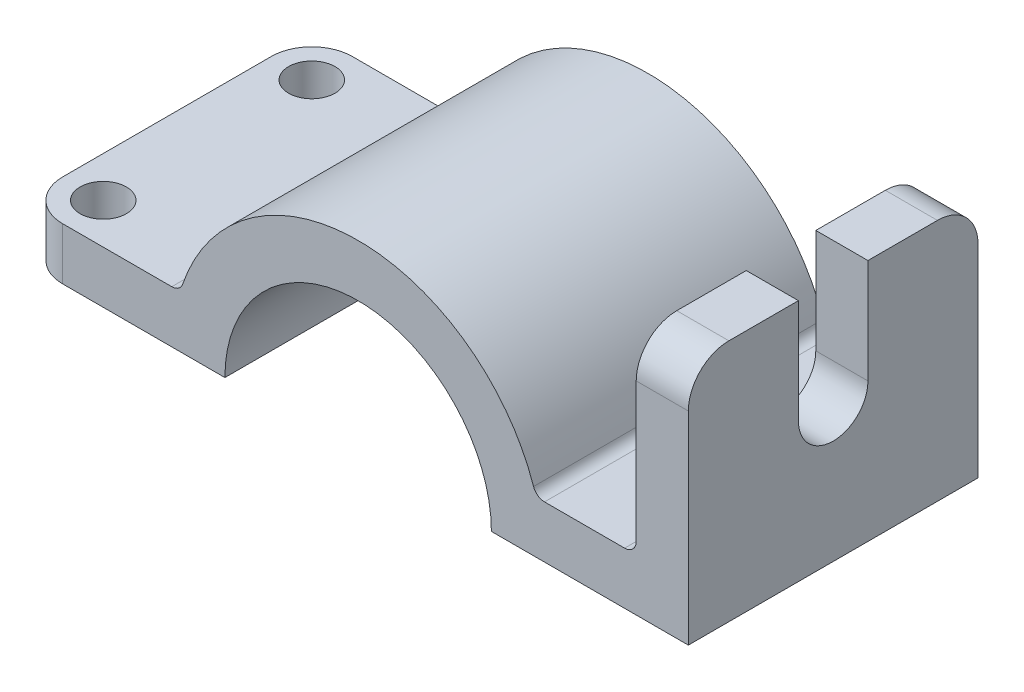
ISO-10303-21;
HEADER;
FILE_DESCRIPTION(('STEP AP214'),'2;1');
FILE_NAME('part.step','',(''),(''),'','','');
FILE_SCHEMA(('AUTOMOTIVE_DESIGN { 1 0 10303 214 1 1 1 1 }'));
ENDSEC;
DATA;
#1=APPLICATION_CONTEXT('core data for automotive mechanical design processes');
#2=APPLICATION_PROTOCOL_DEFINITION('international standard','automotive_design',2000,#1);
#3=PRODUCT_CONTEXT('',#1,'mechanical');
#4=PRODUCT('Part','Part','',(#3));
#5=PRODUCT_RELATED_PRODUCT_CATEGORY('part','',(#4));
#6=PRODUCT_DEFINITION_FORMATION('','',#4);
#7=PRODUCT_DEFINITION_CONTEXT('part definition',#1,'design');
#8=PRODUCT_DEFINITION('design','',#6,#7);
#9=PRODUCT_DEFINITION_SHAPE('','',#8);
#10=(LENGTH_UNIT() NAMED_UNIT(*) SI_UNIT(.MILLI.,.METRE.));
#11=(NAMED_UNIT(*) PLANE_ANGLE_UNIT() SI_UNIT($,.RADIAN.));
#12=(NAMED_UNIT(*) SI_UNIT($,.STERADIAN.) SOLID_ANGLE_UNIT());
#13=UNCERTAINTY_MEASURE_WITH_UNIT(LENGTH_MEASURE(1.E-05),#10,'distance_accuracy_value','');
#14=(GEOMETRIC_REPRESENTATION_CONTEXT(3) GLOBAL_UNCERTAINTY_ASSIGNED_CONTEXT((#13)) GLOBAL_UNIT_ASSIGNED_CONTEXT((#10,
#11,#12)) REPRESENTATION_CONTEXT('',''));
#15=CARTESIAN_POINT('',(0.,0.,0.));
#16=DIRECTION('',(0.,0.,1.));
#17=DIRECTION('',(1.,0.,0.));
#18=AXIS2_PLACEMENT_3D('',#15,#16,#17);
#19=CARTESIAN_POINT('',(57.,42.,25.));
#20=DIRECTION('',(0.,-1.,0.));
#21=DIRECTION('',(0.,0.,-1.));
#22=AXIS2_PLACEMENT_3D('',#19,#20,#21);
#23=PLANE('',#22);
#24=DIRECTION('',(0.,0.,-1.));
#25=VECTOR('',#24,1.);
#26=CARTESIAN_POINT('',(48.,42.,25.));
#27=LINE('',#26,#25);
#28=CARTESIAN_POINT('',(48.,42.,18.));
#29=VERTEX_POINT('',#28);
#30=CARTESIAN_POINT('',(48.,42.,6.));
#31=VERTEX_POINT('',#30);
#32=EDGE_CURVE('E207',#29,#31,#27,.T.);
#33=ORIENTED_EDGE('',*,*,#32,.F.);
#34=DIRECTION('',(-1.,0.,0.));
#35=VECTOR('',#34,1.);
#36=CARTESIAN_POINT('',(57.,42.,18.));
#37=LINE('',#36,#35);
#38=CARTESIAN_POINT('',(57.,42.,18.));
#39=VERTEX_POINT('',#38);
#40=EDGE_CURVE('E322',#29,#39,#37,.F.);
#41=ORIENTED_EDGE('',*,*,#40,.T.);
#42=DIRECTION('',(0.,0.,-1.));
#43=VECTOR('',#42,1.);
#44=CARTESIAN_POINT('',(57.,42.,25.));
#45=LINE('',#44,#43);
#46=CARTESIAN_POINT('',(57.,42.,6.));
#47=VERTEX_POINT('',#46);
#48=EDGE_CURVE('E299',#39,#47,#45,.T.);
#49=ORIENTED_EDGE('',*,*,#48,.T.);
#50=DIRECTION('',(1.,0.,0.));
#51=VECTOR('',#50,1.);
#52=CARTESIAN_POINT('',(-58.001,42.,6.));
#53=LINE('',#52,#51);
#54=EDGE_CURVE('E220',#31,#47,#53,.T.);
#55=ORIENTED_EDGE('',*,*,#54,.F.);
#56=EDGE_LOOP('',(#33,#41,#49,#55));
#57=FACE_BOUND('',#56,.T.);
#58=ADVANCED_FACE('F39',(#57),#23,.F.);
#59=CARTESIAN_POINT('',(57.,42.,-6.));
#60=VERTEX_POINT('',#59);
#61=CARTESIAN_POINT('',(57.,42.,-18.));
#62=VERTEX_POINT('',#61);
#63=EDGE_CURVE('E298',#60,#62,#45,.T.);
#64=ORIENTED_EDGE('',*,*,#63,.T.);
#65=DIRECTION('',(-1.,0.,0.));
#66=VECTOR('',#65,1.);
#67=CARTESIAN_POINT('',(57.,42.,-18.));
#68=LINE('',#67,#66);
#69=CARTESIAN_POINT('',(48.,42.,-18.));
#70=VERTEX_POINT('',#69);
#71=EDGE_CURVE('E306',#62,#70,#68,.T.);
#72=ORIENTED_EDGE('',*,*,#71,.T.);
#73=CARTESIAN_POINT('',(48.,42.,-6.));
#74=VERTEX_POINT('',#73);
#75=EDGE_CURVE('E300',#74,#70,#27,.T.);
#76=ORIENTED_EDGE('',*,*,#75,.F.);
#77=DIRECTION('',(-1.,0.,0.));
#78=VECTOR('',#77,1.);
#79=CARTESIAN_POINT('',(-58.001,42.,-6.));
#80=LINE('',#79,#78);
#81=EDGE_CURVE('E204',#60,#74,#80,.T.);
#82=ORIENTED_EDGE('',*,*,#81,.F.);
#83=EDGE_LOOP('',(#64,#72,#76,#82));
#84=FACE_BOUND('',#83,.T.);
#85=ADVANCED_FACE('F411',(#84),#23,.F.);
#86=CARTESIAN_POINT('',(57.,0.,25.));
#87=DIRECTION('',(-1.,0.,0.));
#88=DIRECTION('',(0.,0.,1.));
#89=AXIS2_PLACEMENT_3D('',#86,#87,#88);
#90=PLANE('',#89);
#91=DIRECTION('',(0.,1.,0.));
#92=VECTOR('',#91,1.);
#93=CARTESIAN_POINT('',(57.,0.,-25.));
#94=LINE('',#93,#92);
#95=CARTESIAN_POINT('',(57.,0.,-25.));
#96=VERTEX_POINT('',#95);
#97=CARTESIAN_POINT('',(57.,35.,-25.));
#98=VERTEX_POINT('',#97);
#99=EDGE_CURVE('E255',#96,#98,#94,.T.);
#100=ORIENTED_EDGE('',*,*,#99,.T.);
#101=CARTESIAN_POINT('',(57.,35.,-18.));
#102=DIRECTION('',(-1.,0.,0.));
#103=DIRECTION('',(0.,0.,1.));
#104=AXIS2_PLACEMENT_3D('',#101,#102,#103);
#105=CIRCLE('',#104,7.);
#106=EDGE_CURVE('E317',#98,#62,#105,.F.);
#107=ORIENTED_EDGE('',*,*,#106,.T.);
#108=ORIENTED_EDGE('',*,*,#63,.F.);
#109=DIRECTION('',(0.,1.,0.));
#110=VECTOR('',#109,1.);
#111=CARTESIAN_POINT('',(57.,24.,-6.));
#112=LINE('',#111,#110);
#113=CARTESIAN_POINT('',(57.,24.,-6.));
#114=VERTEX_POINT('',#113);
#115=EDGE_CURVE('E198',#114,#60,#112,.T.);
#116=ORIENTED_EDGE('',*,*,#115,.F.);
#117=CARTESIAN_POINT('',(57.,24.,0.));
#118=DIRECTION('',(1.,0.,0.));
#119=DIRECTION('',(0.,0.,-1.));
#120=AXIS2_PLACEMENT_3D('',#117,#118,#119);
#121=CIRCLE('',#120,6.);
#122=CARTESIAN_POINT('',(57.,24.,6.));
#123=VERTEX_POINT('',#122);
#124=EDGE_CURVE('E212',#123,#114,#121,.T.);
#125=ORIENTED_EDGE('',*,*,#124,.F.);
#126=DIRECTION('',(0.,-1.,0.));
#127=VECTOR('',#126,1.);
#128=CARTESIAN_POINT('',(57.,24.,6.));
#129=LINE('',#128,#127);
#130=EDGE_CURVE('E193',#47,#123,#129,.T.);
#131=ORIENTED_EDGE('',*,*,#130,.F.);
#132=ORIENTED_EDGE('',*,*,#48,.F.);
#133=CARTESIAN_POINT('',(57.,35.,18.));
#134=DIRECTION('',(-1.,0.,0.));
#135=DIRECTION('',(0.,0.,1.));
#136=AXIS2_PLACEMENT_3D('',#133,#134,#135);
#137=CIRCLE('',#136,7.);
#138=CARTESIAN_POINT('',(57.,35.,25.));
#139=VERTEX_POINT('',#138);
#140=EDGE_CURVE('E320',#39,#139,#137,.F.);
#141=ORIENTED_EDGE('',*,*,#140,.T.);
#142=DIRECTION('',(0.,1.,0.));
#143=VECTOR('',#142,1.);
#144=CARTESIAN_POINT('',(57.,0.,25.));
#145=LINE('',#144,#143);
#146=CARTESIAN_POINT('',(57.,0.,25.));
#147=VERTEX_POINT('',#146);
#148=EDGE_CURVE('E228',#147,#139,#145,.T.);
#149=ORIENTED_EDGE('',*,*,#148,.F.);
#150=DIRECTION('',(0.,0.,-1.));
#151=VECTOR('',#150,1.);
#152=CARTESIAN_POINT('',(57.,0.,25.));
#153=LINE('',#152,#151);
#154=EDGE_CURVE('E305',#147,#96,#153,.T.);
#155=ORIENTED_EDGE('',*,*,#154,.T.);
#156=EDGE_LOOP('',(#100,#107,#108,#116,#125,#131,#132,#141,#149,#155));
#157=FACE_BOUND('',#156,.T.);
#158=ADVANCED_FACE('F371',(#157),#90,.F.);
#159=CARTESIAN_POINT('',(48.,42.,25.));
#160=DIRECTION('',(1.,0.,0.));
#161=DIRECTION('',(0.,1.,0.));
#162=AXIS2_PLACEMENT_3D('',#159,#160,#161);
#163=PLANE('',#162);
#164=ORIENTED_EDGE('',*,*,#75,.T.);
#165=CARTESIAN_POINT('',(48.,35.,-18.));
#166=DIRECTION('',(1.,0.,0.));
#167=DIRECTION('',(0.,1.,0.));
#168=AXIS2_PLACEMENT_3D('',#165,#166,#167);
#169=CIRCLE('',#168,7.);
#170=CARTESIAN_POINT('',(48.,35.,-25.));
#171=VERTEX_POINT('',#170);
#172=EDGE_CURVE('E311',#70,#171,#169,.F.);
#173=ORIENTED_EDGE('',*,*,#172,.T.);
#174=DIRECTION('',(0.,-1.,0.));
#175=VECTOR('',#174,1.);
#176=CARTESIAN_POINT('',(48.,42.,-25.));
#177=LINE('',#176,#175);
#178=CARTESIAN_POINT('',(48.,11.,-25.));
#179=VERTEX_POINT('',#178);
#180=EDGE_CURVE('E260',#171,#179,#177,.T.);
#181=ORIENTED_EDGE('',*,*,#180,.T.);
#182=DIRECTION('',(0.,0.,-1.));
#183=VECTOR('',#182,1.);
#184=CARTESIAN_POINT('',(48.,11.,25.));
#185=LINE('',#184,#183);
#186=CARTESIAN_POINT('',(48.,11.,25.));
#187=VERTEX_POINT('',#186);
#188=EDGE_CURVE('E294',#187,#179,#185,.T.);
#189=ORIENTED_EDGE('',*,*,#188,.F.);
#190=DIRECTION('',(0.,-1.,0.));
#191=VECTOR('',#190,1.);
#192=CARTESIAN_POINT('',(48.,42.,25.));
#193=LINE('',#192,#191);
#194=CARTESIAN_POINT('',(48.,35.,25.));
#195=VERTEX_POINT('',#194);
#196=EDGE_CURVE('E235',#195,#187,#193,.T.);
#197=ORIENTED_EDGE('',*,*,#196,.F.);
#198=CARTESIAN_POINT('',(48.,35.,18.));
#199=DIRECTION('',(1.,0.,0.));
#200=DIRECTION('',(0.,1.,0.));
#201=AXIS2_PLACEMENT_3D('',#198,#199,#200);
#202=CIRCLE('',#201,7.);
#203=EDGE_CURVE('E313',#195,#29,#202,.F.);
#204=ORIENTED_EDGE('',*,*,#203,.T.);
#205=ORIENTED_EDGE('',*,*,#32,.T.);
#206=DIRECTION('',(0.,1.,0.));
#207=VECTOR('',#206,1.);
#208=CARTESIAN_POINT('',(48.,24.,6.));
#209=LINE('',#208,#207);
#210=CARTESIAN_POINT('',(48.,24.,6.));
#211=VERTEX_POINT('',#210);
#212=EDGE_CURVE('E187',#211,#31,#209,.T.);
#213=ORIENTED_EDGE('',*,*,#212,.F.);
#214=CARTESIAN_POINT('',(48.,24.,0.));
#215=DIRECTION('',(1.,0.,0.));
#216=DIRECTION('',(0.,1.,0.));
#217=AXIS2_PLACEMENT_3D('',#214,#215,#216);
#218=CIRCLE('',#217,6.);
#219=CARTESIAN_POINT('',(48.,24.,-6.));
#220=VERTEX_POINT('',#219);
#221=EDGE_CURVE('E199',#220,#211,#218,.F.);
#222=ORIENTED_EDGE('',*,*,#221,.F.);
#223=DIRECTION('',(0.,-1.,0.));
#224=VECTOR('',#223,1.);
#225=CARTESIAN_POINT('',(48.,24.,-6.));
#226=LINE('',#225,#224);
#227=EDGE_CURVE('E209',#74,#220,#226,.T.);
#228=ORIENTED_EDGE('',*,*,#227,.F.);
#229=EDGE_LOOP('',(#164,#173,#181,#189,#197,#204,#205,#213,#222,#228));
#230=FACE_BOUND('',#229,.T.);
#231=ADVANCED_FACE('F210',(#230),#163,.F.);
#232=CARTESIAN_POINT('',(0.,0.,25.));
#233=DIRECTION('',(0.,0.,-1.));
#234=DIRECTION('',(-1.,0.,0.));
#235=AXIS2_PLACEMENT_3D('',#232,#233,#234);
#236=CYLINDRICAL_SURFACE('',#235,23.);
#237=CARTESIAN_POINT('',(0.,0.,-25.));
#238=DIRECTION('',(0.,0.,-1.));
#239=DIRECTION('',(1.,0.,0.));
#240=AXIS2_PLACEMENT_3D('',#237,#238,#239);
#241=CIRCLE('',#240,23.);
#242=CARTESIAN_POINT('',(-23.,0.,-25.));
#243=VERTEX_POINT('',#242);
#244=CARTESIAN_POINT('',(23.,0.,-25.));
#245=VERTEX_POINT('',#244);
#246=EDGE_CURVE('E225',#243,#245,#241,.T.);
#247=ORIENTED_EDGE('',*,*,#246,.T.);
#248=DIRECTION('',(0.,0.,-1.));
#249=VECTOR('',#248,1.);
#250=CARTESIAN_POINT('',(23.,0.,25.));
#251=LINE('',#250,#249);
#252=CARTESIAN_POINT('',(23.,0.,25.));
#253=VERTEX_POINT('',#252);
#254=EDGE_CURVE('E304',#253,#245,#251,.T.);
#255=ORIENTED_EDGE('',*,*,#254,.F.);
#256=CARTESIAN_POINT('',(0.,0.,25.));
#257=DIRECTION('',(0.,0.,-1.));
#258=DIRECTION('',(1.,0.,0.));
#259=AXIS2_PLACEMENT_3D('',#256,#257,#258);
#260=CIRCLE('',#259,23.);
#261=CARTESIAN_POINT('',(-23.,0.,25.));
#262=VERTEX_POINT('',#261);
#263=EDGE_CURVE('E224',#262,#253,#260,.T.);
#264=ORIENTED_EDGE('',*,*,#263,.F.);
#265=DIRECTION('',(0.,0.,-1.));
#266=VECTOR('',#265,1.);
#267=CARTESIAN_POINT('',(-23.,0.,25.));
#268=LINE('',#267,#266);
#269=EDGE_CURVE('E247',#262,#243,#268,.T.);
#270=ORIENTED_EDGE('',*,*,#269,.T.);
#271=EDGE_LOOP('',(#247,#255,#264,#270));
#272=FACE_BOUND('',#271,.T.);
#273=ADVANCED_FACE('F361',(#272),#236,.F.);
#274=CARTESIAN_POINT('',(23.,0.,25.));
#275=DIRECTION('',(0.,1.,0.));
#276=DIRECTION('',(0.,0.,1.));
#277=AXIS2_PLACEMENT_3D('',#274,#275,#276);
#278=PLANE('',#277);
#279=DIRECTION('',(1.,0.,0.));
#280=VECTOR('',#279,1.);
#281=CARTESIAN_POINT('',(23.,0.,-25.));
#282=LINE('',#281,#280);
#283=EDGE_CURVE('E252',#245,#96,#282,.T.);
#284=ORIENTED_EDGE('',*,*,#283,.T.);
#285=ORIENTED_EDGE('',*,*,#154,.F.);
#286=DIRECTION('',(1.,0.,0.));
#287=VECTOR('',#286,1.);
#288=CARTESIAN_POINT('',(23.,0.,25.));
#289=LINE('',#288,#287);
#290=EDGE_CURVE('E226',#253,#147,#289,.T.);
#291=ORIENTED_EDGE('',*,*,#290,.F.);
#292=ORIENTED_EDGE('',*,*,#254,.T.);
#293=EDGE_LOOP('',(#284,#285,#291,#292));
#294=FACE_BOUND('',#293,.T.);
#295=ADVANCED_FACE('F369',(#294),#278,.F.);
#296=CARTESIAN_POINT('',(46.,11.,25.));
#297=DIRECTION('',(0.,0.,-1.));
#298=DIRECTION('',(-1.,0.,0.));
#299=AXIS2_PLACEMENT_3D('',#296,#297,#298);
#300=CYLINDRICAL_SURFACE('',#299,2.);
#301=CARTESIAN_POINT('',(46.,11.,-25.));
#302=DIRECTION('',(0.,0.,-1.));
#303=DIRECTION('',(-1.,0.,0.));
#304=AXIS2_PLACEMENT_3D('',#301,#302,#303);
#305=CIRCLE('',#304,2.);
#306=CARTESIAN_POINT('',(46.,9.00000000000001,-25.));
#307=VERTEX_POINT('',#306);
#308=EDGE_CURVE('E259',#179,#307,#305,.T.);
#309=ORIENTED_EDGE('',*,*,#308,.T.);
#310=DIRECTION('',(0.,0.,-1.));
#311=VECTOR('',#310,1.);
#312=CARTESIAN_POINT('',(46.,9.00000000000001,25.));
#313=LINE('',#312,#311);
#314=CARTESIAN_POINT('',(46.,9.00000000000001,25.));
#315=VERTEX_POINT('',#314);
#316=EDGE_CURVE('E292',#315,#307,#313,.T.);
#317=ORIENTED_EDGE('',*,*,#316,.F.);
#318=CARTESIAN_POINT('',(46.,11.,25.));
#319=DIRECTION('',(0.,0.,-1.));
#320=DIRECTION('',(-1.,0.,0.));
#321=AXIS2_PLACEMENT_3D('',#318,#319,#320);
#322=CIRCLE('',#321,2.);
#323=EDGE_CURVE('E232',#187,#315,#322,.T.);
#324=ORIENTED_EDGE('',*,*,#323,.F.);
#325=ORIENTED_EDGE('',*,*,#188,.T.);
#326=EDGE_LOOP('',(#309,#317,#324,#325));
#327=FACE_BOUND('',#326,.T.);
#328=ADVANCED_FACE('F383',(#327),#300,.F.);
#329=CARTESIAN_POINT('',(46.,9.00000000000001,25.));
#330=DIRECTION('',(0.,-1.,0.));
#331=DIRECTION('',(1.,0.,0.));
#332=AXIS2_PLACEMENT_3D('',#329,#330,#331);
#333=PLANE('',#332);
#334=DIRECTION('',(-1.,0.,0.));
#335=VECTOR('',#334,1.);
#336=CARTESIAN_POINT('',(46.,9.00000000000001,-25.));
#337=LINE('',#336,#335);
#338=CARTESIAN_POINT('',(32.1714158842908,9.,-25.));
#339=VERTEX_POINT('',#338);
#340=EDGE_CURVE('E261',#307,#339,#337,.T.);
#341=ORIENTED_EDGE('',*,*,#340,.T.);
#342=DIRECTION('',(0.,0.,-1.));
#343=VECTOR('',#342,1.);
#344=CARTESIAN_POINT('',(32.1714158842908,9.,25.));
#345=LINE('',#344,#343);
#346=CARTESIAN_POINT('',(32.1714158842908,9.,25.));
#347=VERTEX_POINT('',#346);
#348=EDGE_CURVE('E286',#347,#339,#345,.T.);
#349=ORIENTED_EDGE('',*,*,#348,.F.);
#350=DIRECTION('',(-1.,0.,0.));
#351=VECTOR('',#350,1.);
#352=CARTESIAN_POINT('',(46.,9.00000000000001,25.));
#353=LINE('',#352,#351);
#354=EDGE_CURVE('E237',#315,#347,#353,.T.);
#355=ORIENTED_EDGE('',*,*,#354,.F.);
#356=ORIENTED_EDGE('',*,*,#316,.T.);
#357=EDGE_LOOP('',(#341,#349,#355,#356));
#358=FACE_BOUND('',#357,.T.);
#359=ADVANCED_FACE('F388',(#358),#333,.F.);
#360=CARTESIAN_POINT('',(32.1714158842908,11.,25.));
#361=DIRECTION('',(0.,0.,-1.));
#362=DIRECTION('',(-1.,0.,0.));
#363=AXIS2_PLACEMENT_3D('',#360,#361,#362);
#364=CYLINDRICAL_SURFACE('',#363,2.);
#365=CARTESIAN_POINT('',(32.1714158842908,11.,-25.));
#366=DIRECTION('',(0.,0.,-1.));
#367=DIRECTION('',(-1.,0.,0.));
#368=AXIS2_PLACEMENT_3D('',#365,#366,#367);
#369=CIRCLE('',#368,2.);
#370=CARTESIAN_POINT('',(30.2789796558031,10.3529411764706,-25.));
#371=VERTEX_POINT('',#370);
#372=EDGE_CURVE('E263',#339,#371,#369,.T.);
#373=ORIENTED_EDGE('',*,*,#372,.T.);
#374=DIRECTION('',(0.,0.,-1.));
#375=VECTOR('',#374,1.);
#376=CARTESIAN_POINT('',(30.2789796558031,10.3529411764706,25.));
#377=LINE('',#376,#375);
#378=CARTESIAN_POINT('',(30.2789796558031,10.3529411764706,25.));
#379=VERTEX_POINT('',#378);
#380=EDGE_CURVE('E284',#379,#371,#377,.T.);
#381=ORIENTED_EDGE('',*,*,#380,.F.);
#382=CARTESIAN_POINT('',(32.1714158842908,11.,25.));
#383=DIRECTION('',(0.,0.,-1.));
#384=DIRECTION('',(-1.,0.,0.));
#385=AXIS2_PLACEMENT_3D('',#382,#383,#384);
#386=CIRCLE('',#385,2.);
#387=EDGE_CURVE('E236',#347,#379,#386,.T.);
#388=ORIENTED_EDGE('',*,*,#387,.F.);
#389=ORIENTED_EDGE('',*,*,#348,.T.);
#390=EDGE_LOOP('',(#373,#381,#388,#389));
#391=FACE_BOUND('',#390,.T.);
#392=ADVANCED_FACE('F393',(#391),#364,.F.);
#393=CARTESIAN_POINT('',(0.,0.,25.));
#394=DIRECTION('',(0.,0.,-1.));
#395=DIRECTION('',(-1.,0.,0.));
#396=AXIS2_PLACEMENT_3D('',#393,#394,#395);
#397=CYLINDRICAL_SURFACE('',#396,32.);
#398=CARTESIAN_POINT('',(0.,0.,-25.));
#399=DIRECTION('',(0.,0.,1.));
#400=DIRECTION('',(1.,0.,0.));
#401=AXIS2_PLACEMENT_3D('',#398,#399,#400);
#402=CIRCLE('',#401,32.);
#403=CARTESIAN_POINT('',(-30.2789796558031,10.3529411764706,-25.));
#404=VERTEX_POINT('',#403);
#405=EDGE_CURVE('E264',#371,#404,#402,.T.);
#406=ORIENTED_EDGE('',*,*,#405,.T.);
#407=DIRECTION('',(0.,0.,-1.));
#408=VECTOR('',#407,1.);
#409=CARTESIAN_POINT('',(-30.2789796558031,10.3529411764706,25.));
#410=LINE('',#409,#408);
#411=CARTESIAN_POINT('',(-30.2789796558031,10.3529411764706,25.));
#412=VERTEX_POINT('',#411);
#413=EDGE_CURVE('E285',#412,#404,#410,.T.);
#414=ORIENTED_EDGE('',*,*,#413,.F.);
#415=CARTESIAN_POINT('',(0.,0.,25.));
#416=DIRECTION('',(0.,0.,1.));
#417=DIRECTION('',(1.,0.,0.));
#418=AXIS2_PLACEMENT_3D('',#415,#416,#417);
#419=CIRCLE('',#418,32.);
#420=EDGE_CURVE('E238',#379,#412,#419,.T.);
#421=ORIENTED_EDGE('',*,*,#420,.F.);
#422=ORIENTED_EDGE('',*,*,#380,.T.);
#423=EDGE_LOOP('',(#406,#414,#421,#422));
#424=FACE_BOUND('',#423,.T.);
#425=ADVANCED_FACE('F397',(#424),#397,.T.);
#426=CARTESIAN_POINT('',(-32.1714158842908,11.,25.));
#427=DIRECTION('',(0.,0.,-1.));
#428=DIRECTION('',(-1.,0.,0.));
#429=AXIS2_PLACEMENT_3D('',#426,#427,#428);
#430=CYLINDRICAL_SURFACE('',#429,2.);
#431=CARTESIAN_POINT('',(-32.1714158842908,11.,-25.));
#432=DIRECTION('',(0.,0.,-1.));
#433=DIRECTION('',(1.,0.,0.));
#434=AXIS2_PLACEMENT_3D('',#431,#432,#433);
#435=CIRCLE('',#434,2.);
#436=CARTESIAN_POINT('',(-32.1714158842908,9.,-25.));
#437=VERTEX_POINT('',#436);
#438=EDGE_CURVE('E270',#404,#437,#435,.T.);
#439=ORIENTED_EDGE('',*,*,#438,.T.);
#440=DIRECTION('',(0.,0.,-1.));
#441=VECTOR('',#440,1.);
#442=CARTESIAN_POINT('',(-32.1714158842908,9.,25.));
#443=LINE('',#442,#441);
#444=CARTESIAN_POINT('',(-32.1714158842908,9.,25.));
#445=VERTEX_POINT('',#444);
#446=EDGE_CURVE('E276',#445,#437,#443,.T.);
#447=ORIENTED_EDGE('',*,*,#446,.F.);
#448=CARTESIAN_POINT('',(-32.1714158842908,11.,25.));
#449=DIRECTION('',(0.,0.,-1.));
#450=DIRECTION('',(1.,0.,0.));
#451=AXIS2_PLACEMENT_3D('',#448,#449,#450);
#452=CIRCLE('',#451,2.);
#453=EDGE_CURVE('E245',#412,#445,#452,.T.);
#454=ORIENTED_EDGE('',*,*,#453,.F.);
#455=ORIENTED_EDGE('',*,*,#413,.T.);
#456=EDGE_LOOP('',(#439,#447,#454,#455));
#457=FACE_BOUND('',#456,.T.);
#458=ADVANCED_FACE('F405',(#457),#430,.F.);
#459=CARTESIAN_POINT('',(-32.1714158842908,9.,25.));
#460=DIRECTION('',(0.,-1.,0.));
#461=DIRECTION('',(1.,0.,0.));
#462=AXIS2_PLACEMENT_3D('',#459,#460,#461);
#463=PLANE('',#462);
#464=CARTESIAN_POINT('',(-51.,9.,-18.));
#465=DIRECTION('',(0.,1.,0.));
#466=DIRECTION('',(-1.,0.,0.));
#467=AXIS2_PLACEMENT_3D('',#464,#465,#466);
#468=CIRCLE('',#467,4.);
#469=CARTESIAN_POINT('',(-55.,9.,-18.));
#470=VERTEX_POINT('',#469);
#471=EDGE_CURVE('E425',#470,#470,#468,.T.);
#472=ORIENTED_EDGE('',*,*,#471,.F.);
#473=EDGE_LOOP('',(#472));
#474=FACE_BOUND('',#473,.T.);
#475=CARTESIAN_POINT('',(-51.,9.,18.));
#476=DIRECTION('',(0.,1.,0.));
#477=DIRECTION('',(-1.,0.,0.));
#478=AXIS2_PLACEMENT_3D('',#475,#476,#477);
#479=CIRCLE('',#478,4.);
#480=CARTESIAN_POINT('',(-55.,9.,18.));
#481=VERTEX_POINT('',#480);
#482=EDGE_CURVE('E420',#481,#481,#479,.T.);
#483=ORIENTED_EDGE('',*,*,#482,.F.);
#484=EDGE_LOOP('',(#483));
#485=FACE_BOUND('',#484,.T.);
#486=DIRECTION('',(0.,0.,-1.));
#487=VECTOR('',#486,1.);
#488=CARTESIAN_POINT('',(-58.,9.,25.));
#489=LINE('',#488,#487);
#490=CARTESIAN_POINT('',(-58.,9.,18.));
#491=VERTEX_POINT('',#490);
#492=CARTESIAN_POINT('',(-58.,9.,-18.));
#493=VERTEX_POINT('',#492);
#494=EDGE_CURVE('E280',#491,#493,#489,.T.);
#495=ORIENTED_EDGE('',*,*,#494,.F.);
#496=CARTESIAN_POINT('',(-51.,9.,18.));
#497=DIRECTION('',(0.,-1.,0.));
#498=DIRECTION('',(1.,0.,0.));
#499=AXIS2_PLACEMENT_3D('',#496,#497,#498);
#500=CIRCLE('',#499,7.);
#501=CARTESIAN_POINT('',(-51.,9.,25.));
#502=VERTEX_POINT('',#501);
#503=EDGE_CURVE('E50',#491,#502,#500,.F.);
#504=ORIENTED_EDGE('',*,*,#503,.T.);
#505=DIRECTION('',(-1.,0.,0.));
#506=VECTOR('',#505,1.);
#507=CARTESIAN_POINT('',(-32.1714158842908,9.,25.));
#508=LINE('',#507,#506);
#509=EDGE_CURVE('E243',#445,#502,#508,.T.);
#510=ORIENTED_EDGE('',*,*,#509,.F.);
#511=ORIENTED_EDGE('',*,*,#446,.T.);
#512=DIRECTION('',(-1.,0.,0.));
#513=VECTOR('',#512,1.);
#514=CARTESIAN_POINT('',(-32.1714158842908,9.,-25.));
#515=LINE('',#514,#513);
#516=CARTESIAN_POINT('',(-51.,9.,-25.));
#517=VERTEX_POINT('',#516);
#518=EDGE_CURVE('E267',#437,#517,#515,.T.);
#519=ORIENTED_EDGE('',*,*,#518,.T.);
#520=CARTESIAN_POINT('',(-51.,9.,-18.));
#521=DIRECTION('',(0.,-1.,0.));
#522=DIRECTION('',(1.,0.,0.));
#523=AXIS2_PLACEMENT_3D('',#520,#521,#522);
#524=CIRCLE('',#523,7.);
#525=EDGE_CURVE('E56',#517,#493,#524,.F.);
#526=ORIENTED_EDGE('',*,*,#525,.T.);
#527=EDGE_LOOP('',(#495,#504,#510,#511,#519,#526));
#528=FACE_BOUND('',#527,.T.);
#529=ADVANCED_FACE('F339',(#474,#485,#528),#463,.F.);
#530=CARTESIAN_POINT('',(-58.,9.,25.));
#531=DIRECTION('',(1.,0.,0.));
#532=DIRECTION('',(0.,0.,-1.));
#533=AXIS2_PLACEMENT_3D('',#530,#531,#532);
#534=PLANE('',#533);
#535=DIRECTION('',(0.,0.,-1.));
#536=VECTOR('',#535,1.);
#537=CARTESIAN_POINT('',(-58.,0.,25.));
#538=LINE('',#537,#536);
#539=CARTESIAN_POINT('',(-58.,0.,18.));
#540=VERTEX_POINT('',#539);
#541=CARTESIAN_POINT('',(-58.,0.,-18.));
#542=VERTEX_POINT('',#541);
#543=EDGE_CURVE('E273',#540,#542,#538,.T.);
#544=ORIENTED_EDGE('',*,*,#543,.F.);
#545=DIRECTION('',(0.,-1.,0.));
#546=VECTOR('',#545,1.);
#547=CARTESIAN_POINT('',(-58.,9.,18.));
#548=LINE('',#547,#546);
#549=EDGE_CURVE('E336',#540,#491,#548,.F.);
#550=ORIENTED_EDGE('',*,*,#549,.T.);
#551=ORIENTED_EDGE('',*,*,#494,.T.);
#552=DIRECTION('',(0.,-1.,0.));
#553=VECTOR('',#552,1.);
#554=CARTESIAN_POINT('',(-58.,9.,-18.));
#555=LINE('',#554,#553);
#556=EDGE_CURVE('E334',#493,#542,#555,.T.);
#557=ORIENTED_EDGE('',*,*,#556,.T.);
#558=EDGE_LOOP('',(#544,#550,#551,#557));
#559=FACE_BOUND('',#558,.T.);
#560=ADVANCED_FACE('F354',(#559),#534,.F.);
#561=CARTESIAN_POINT('',(-58.,0.,25.));
#562=DIRECTION('',(0.,1.,0.));
#563=DIRECTION('',(0.,0.,1.));
#564=AXIS2_PLACEMENT_3D('',#561,#562,#563);
#565=PLANE('',#564);
#566=CARTESIAN_POINT('',(-51.,0.,-18.));
#567=DIRECTION('',(0.,1.,0.));
#568=DIRECTION('',(0.,0.,1.));
#569=AXIS2_PLACEMENT_3D('',#566,#567,#568);
#570=CIRCLE('',#569,4.);
#571=CARTESIAN_POINT('',(-51.,0.,-14.));
#572=VERTEX_POINT('',#571);
#573=EDGE_CURVE('E218',#572,#572,#570,.F.);
#574=ORIENTED_EDGE('',*,*,#573,.F.);
#575=EDGE_LOOP('',(#574));
#576=FACE_BOUND('',#575,.T.);
#577=CARTESIAN_POINT('',(-51.,0.,18.));
#578=DIRECTION('',(0.,1.,0.));
#579=DIRECTION('',(0.,0.,1.));
#580=AXIS2_PLACEMENT_3D('',#577,#578,#579);
#581=CIRCLE('',#580,4.);
#582=CARTESIAN_POINT('',(-51.,0.,22.));
#583=VERTEX_POINT('',#582);
#584=EDGE_CURVE('E421',#583,#583,#581,.F.);
#585=ORIENTED_EDGE('',*,*,#584,.F.);
#586=EDGE_LOOP('',(#585));
#587=FACE_BOUND('',#586,.T.);
#588=DIRECTION('',(1.,0.,0.));
#589=VECTOR('',#588,1.);
#590=CARTESIAN_POINT('',(-58.,0.,25.));
#591=LINE('',#590,#589);
#592=CARTESIAN_POINT('',(-51.,0.,25.));
#593=VERTEX_POINT('',#592);
#594=EDGE_CURVE('E250',#593,#262,#591,.T.);
#595=ORIENTED_EDGE('',*,*,#594,.F.);
#596=CARTESIAN_POINT('',(-51.,0.,18.));
#597=DIRECTION('',(0.,1.,0.));
#598=DIRECTION('',(0.,0.,1.));
#599=AXIS2_PLACEMENT_3D('',#596,#597,#598);
#600=CIRCLE('',#599,7.);
#601=EDGE_CURVE('E332',#593,#540,#600,.F.);
#602=ORIENTED_EDGE('',*,*,#601,.T.);
#603=ORIENTED_EDGE('',*,*,#543,.T.);
#604=CARTESIAN_POINT('',(-51.,0.,-18.));
#605=DIRECTION('',(0.,1.,0.));
#606=DIRECTION('',(0.,0.,1.));
#607=AXIS2_PLACEMENT_3D('',#604,#605,#606);
#608=CIRCLE('',#607,7.);
#609=CARTESIAN_POINT('',(-51.,0.,-25.));
#610=VERTEX_POINT('',#609);
#611=EDGE_CURVE('E328',#542,#610,#608,.F.);
#612=ORIENTED_EDGE('',*,*,#611,.T.);
#613=DIRECTION('',(1.,0.,0.));
#614=VECTOR('',#613,1.);
#615=CARTESIAN_POINT('',(-58.,0.,-25.));
#616=LINE('',#615,#614);
#617=EDGE_CURVE('E230',#610,#243,#616,.T.);
#618=ORIENTED_EDGE('',*,*,#617,.T.);
#619=ORIENTED_EDGE('',*,*,#269,.F.);
#620=EDGE_LOOP('',(#595,#602,#603,#612,#618,#619));
#621=FACE_BOUND('',#620,.T.);
#622=ADVANCED_FACE('F355',(#576,#587,#621),#565,.F.);
#623=CARTESIAN_POINT('',(0.,0.,25.));
#624=DIRECTION('',(0.,0.,1.));
#625=DIRECTION('',(1.,0.,0.));
#626=AXIS2_PLACEMENT_3D('',#623,#624,#625);
#627=PLANE('',#626);
#628=ORIENTED_EDGE('',*,*,#509,.T.);
#629=DIRECTION('',(0.,-1.,0.));
#630=VECTOR('',#629,1.);
#631=CARTESIAN_POINT('',(-51.,0.,25.));
#632=LINE('',#631,#630);
#633=EDGE_CURVE('E326',#502,#593,#632,.T.);
#634=ORIENTED_EDGE('',*,*,#633,.T.);
#635=ORIENTED_EDGE('',*,*,#594,.T.);
#636=ORIENTED_EDGE('',*,*,#263,.T.);
#637=ORIENTED_EDGE('',*,*,#290,.T.);
#638=ORIENTED_EDGE('',*,*,#148,.T.);
#639=DIRECTION('',(-1.,0.,0.));
#640=VECTOR('',#639,1.);
#641=CARTESIAN_POINT('',(48.,35.,25.));
#642=LINE('',#641,#640);
#643=EDGE_CURVE('E321',#139,#195,#642,.T.);
#644=ORIENTED_EDGE('',*,*,#643,.T.);
#645=ORIENTED_EDGE('',*,*,#196,.T.);
#646=ORIENTED_EDGE('',*,*,#323,.T.);
#647=ORIENTED_EDGE('',*,*,#354,.T.);
#648=ORIENTED_EDGE('',*,*,#387,.T.);
#649=ORIENTED_EDGE('',*,*,#420,.T.);
#650=ORIENTED_EDGE('',*,*,#453,.T.);
#651=EDGE_LOOP('',(#628,#634,#635,#636,#637,#638,#644,#645,#646,#647,#648,#649,#650));
#652=FACE_BOUND('',#651,.T.);
#653=ADVANCED_FACE('F344',(#652),#627,.T.);
#654=CARTESIAN_POINT('',(0.,0.,-25.));
#655=DIRECTION('',(0.,0.,1.));
#656=DIRECTION('',(1.,0.,0.));
#657=AXIS2_PLACEMENT_3D('',#654,#655,#656);
#658=PLANE('',#657);
#659=ORIENTED_EDGE('',*,*,#617,.F.);
#660=DIRECTION('',(0.,-1.,0.));
#661=VECTOR('',#660,1.);
#662=CARTESIAN_POINT('',(-51.,0.,-25.));
#663=LINE('',#662,#661);
#664=EDGE_CURVE('E11',#610,#517,#663,.F.);
#665=ORIENTED_EDGE('',*,*,#664,.T.);
#666=ORIENTED_EDGE('',*,*,#518,.F.);
#667=ORIENTED_EDGE('',*,*,#438,.F.);
#668=ORIENTED_EDGE('',*,*,#405,.F.);
#669=ORIENTED_EDGE('',*,*,#372,.F.);
#670=ORIENTED_EDGE('',*,*,#340,.F.);
#671=ORIENTED_EDGE('',*,*,#308,.F.);
#672=ORIENTED_EDGE('',*,*,#180,.F.);
#673=DIRECTION('',(-1.,0.,0.));
#674=VECTOR('',#673,1.);
#675=CARTESIAN_POINT('',(0.,35.,-25.));
#676=LINE('',#675,#674);
#677=EDGE_CURVE('E312',#171,#98,#676,.F.);
#678=ORIENTED_EDGE('',*,*,#677,.T.);
#679=ORIENTED_EDGE('',*,*,#99,.F.);
#680=ORIENTED_EDGE('',*,*,#283,.F.);
#681=ORIENTED_EDGE('',*,*,#246,.F.);
#682=EDGE_LOOP('',(#659,#665,#666,#667,#668,#669,#670,#671,#672,#678,#679,#680,#681));
#683=FACE_BOUND('',#682,.T.);
#684=ADVANCED_FACE('F357',(#683),#658,.F.);
#685=CARTESIAN_POINT('',(-58.001,24.,-6.));
#686=DIRECTION('',(0.,0.,-1.));
#687=DIRECTION('',(-1.,0.,0.));
#688=AXIS2_PLACEMENT_3D('',#685,#686,#687);
#689=PLANE('',#688);
#690=ORIENTED_EDGE('',*,*,#227,.T.);
#691=DIRECTION('',(1.,0.,0.));
#692=VECTOR('',#691,1.);
#693=CARTESIAN_POINT('',(-58.001,24.,-6.));
#694=LINE('',#693,#692);
#695=EDGE_CURVE('E194',#220,#114,#694,.T.);
#696=ORIENTED_EDGE('',*,*,#695,.T.);
#697=ORIENTED_EDGE('',*,*,#115,.T.);
#698=ORIENTED_EDGE('',*,*,#81,.T.);
#699=EDGE_LOOP('',(#690,#696,#697,#698));
#700=FACE_BOUND('',#699,.T.);
#701=ADVANCED_FACE('F418',(#700),#689,.F.);
#702=CARTESIAN_POINT('',(-58.001,24.,6.));
#703=DIRECTION('',(0.,0.,1.));
#704=DIRECTION('',(1.,0.,0.));
#705=AXIS2_PLACEMENT_3D('',#702,#703,#704);
#706=PLANE('',#705);
#707=ORIENTED_EDGE('',*,*,#212,.T.);
#708=ORIENTED_EDGE('',*,*,#54,.T.);
#709=ORIENTED_EDGE('',*,*,#130,.T.);
#710=DIRECTION('',(1.,0.,0.));
#711=VECTOR('',#710,1.);
#712=CARTESIAN_POINT('',(-58.001,24.,6.));
#713=LINE('',#712,#711);
#714=EDGE_CURVE('E181',#211,#123,#713,.T.);
#715=ORIENTED_EDGE('',*,*,#714,.F.);
#716=EDGE_LOOP('',(#707,#708,#709,#715));
#717=FACE_BOUND('',#716,.T.);
#718=ADVANCED_FACE('F183',(#717),#706,.F.);
#719=CARTESIAN_POINT('',(-58.001,24.,0.));
#720=DIRECTION('',(1.,0.,0.));
#721=DIRECTION('',(0.,0.,-1.));
#722=AXIS2_PLACEMENT_3D('',#719,#720,#721);
#723=CYLINDRICAL_SURFACE('',#722,6.);
#724=ORIENTED_EDGE('',*,*,#221,.T.);
#725=ORIENTED_EDGE('',*,*,#714,.T.);
#726=ORIENTED_EDGE('',*,*,#124,.T.);
#727=ORIENTED_EDGE('',*,*,#695,.F.);
#728=EDGE_LOOP('',(#724,#725,#726,#727));
#729=FACE_BOUND('',#728,.T.);
#730=ADVANCED_FACE('F203',(#729),#723,.F.);
#731=CARTESIAN_POINT('',(57.,35.,-18.));
#732=DIRECTION('',(-1.,0.,0.));
#733=DIRECTION('',(0.,0.,1.));
#734=AXIS2_PLACEMENT_3D('',#731,#732,#733);
#735=CYLINDRICAL_SURFACE('',#734,7.);
#736=ORIENTED_EDGE('',*,*,#106,.F.);
#737=ORIENTED_EDGE('',*,*,#677,.F.);
#738=ORIENTED_EDGE('',*,*,#172,.F.);
#739=ORIENTED_EDGE('',*,*,#71,.F.);
#740=EDGE_LOOP('',(#736,#737,#738,#739));
#741=FACE_BOUND('',#740,.T.);
#742=ADVANCED_FACE('F406',(#741),#735,.T.);
#743=CARTESIAN_POINT('',(0.,35.,18.));
#744=DIRECTION('',(1.,0.,0.));
#745=DIRECTION('',(0.,0.,-1.));
#746=AXIS2_PLACEMENT_3D('',#743,#744,#745);
#747=CYLINDRICAL_SURFACE('',#746,7.);
#748=ORIENTED_EDGE('',*,*,#140,.F.);
#749=ORIENTED_EDGE('',*,*,#40,.F.);
#750=ORIENTED_EDGE('',*,*,#203,.F.);
#751=ORIENTED_EDGE('',*,*,#643,.F.);
#752=EDGE_LOOP('',(#748,#749,#750,#751));
#753=FACE_BOUND('',#752,.T.);
#754=ADVANCED_FACE('F376',(#753),#747,.T.);
#755=CARTESIAN_POINT('',(-51.,0.,18.));
#756=DIRECTION('',(0.,1.,0.));
#757=DIRECTION('',(0.,0.,1.));
#758=AXIS2_PLACEMENT_3D('',#755,#756,#757);
#759=CYLINDRICAL_SURFACE('',#758,7.);
#760=ORIENTED_EDGE('',*,*,#503,.F.);
#761=ORIENTED_EDGE('',*,*,#549,.F.);
#762=ORIENTED_EDGE('',*,*,#601,.F.);
#763=ORIENTED_EDGE('',*,*,#633,.F.);
#764=EDGE_LOOP('',(#760,#761,#762,#763));
#765=FACE_BOUND('',#764,.T.);
#766=ADVANCED_FACE('F349',(#765),#759,.T.);
#767=CARTESIAN_POINT('',(-51.,9.,-18.));
#768=DIRECTION('',(0.,-1.,0.));
#769=DIRECTION('',(0.,0.,-1.));
#770=AXIS2_PLACEMENT_3D('',#767,#768,#769);
#771=CYLINDRICAL_SURFACE('',#770,7.);
#772=ORIENTED_EDGE('',*,*,#525,.F.);
#773=ORIENTED_EDGE('',*,*,#664,.F.);
#774=ORIENTED_EDGE('',*,*,#611,.F.);
#775=ORIENTED_EDGE('',*,*,#556,.F.);
#776=EDGE_LOOP('',(#772,#773,#774,#775));
#777=FACE_BOUND('',#776,.T.);
#778=ADVANCED_FACE('F41',(#777),#771,.T.);
#779=CARTESIAN_POINT('',(-51.,-0.00100000000001488,18.));
#780=DIRECTION('',(0.,1.,0.));
#781=DIRECTION('',(-1.,0.,0.));
#782=AXIS2_PLACEMENT_3D('',#779,#780,#781);
#783=CYLINDRICAL_SURFACE('',#782,4.);
#784=ORIENTED_EDGE('',*,*,#482,.T.);
#785=EDGE_LOOP('',(#784));
#786=FACE_BOUND('',#785,.T.);
#787=ORIENTED_EDGE('',*,*,#584,.T.);
#788=EDGE_LOOP('',(#787));
#789=FACE_BOUND('',#788,.T.);
#790=ADVANCED_FACE('F438',(#786,#789),#783,.F.);
#791=CARTESIAN_POINT('',(-51.,-0.00100000000001488,-18.));
#792=DIRECTION('',(0.,1.,0.));
#793=DIRECTION('',(-1.,0.,0.));
#794=AXIS2_PLACEMENT_3D('',#791,#792,#793);
#795=CYLINDRICAL_SURFACE('',#794,4.);
#796=ORIENTED_EDGE('',*,*,#471,.T.);
#797=EDGE_LOOP('',(#796));
#798=FACE_BOUND('',#797,.T.);
#799=ORIENTED_EDGE('',*,*,#573,.T.);
#800=EDGE_LOOP('',(#799));
#801=FACE_BOUND('',#800,.T.);
#802=ADVANCED_FACE('F431',(#798,#801),#795,.F.);
#803=CLOSED_SHELL('',(#58,#85,#158,#231,#273,#295,#328,#359,#392,#425,#458,#529,#560,#622,#653,
#684,#701,#718,#730,#742,#754,#766,#778,#790,#802));
#804=MANIFOLD_SOLID_BREP('B2',#803);
#805=ADVANCED_BREP_SHAPE_REPRESENTATION('',(#18,#804),#14);
#806=SHAPE_DEFINITION_REPRESENTATION(#9,#805);
ENDSEC;
END-ISO-10303-21;
